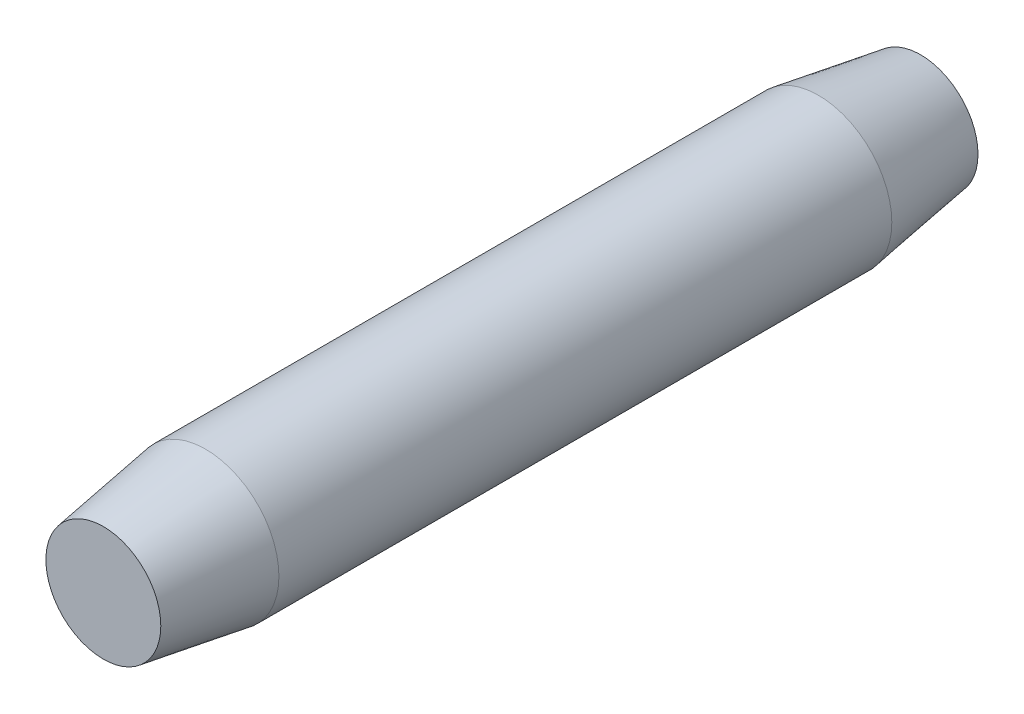
ISO-10303-21;
HEADER;
FILE_DESCRIPTION(('STEP AP214'),'2;1');
FILE_NAME('part.step','',(''),(''),'','','');
FILE_SCHEMA(('AUTOMOTIVE_DESIGN { 1 0 10303 214 1 1 1 1 }'));
ENDSEC;
DATA;
#1=APPLICATION_CONTEXT('core data for automotive mechanical design processes');
#2=APPLICATION_PROTOCOL_DEFINITION('international standard','automotive_design',2000,#1);
#3=PRODUCT_CONTEXT('',#1,'mechanical');
#4=PRODUCT('Part','Part','',(#3));
#5=PRODUCT_RELATED_PRODUCT_CATEGORY('part','',(#4));
#6=PRODUCT_DEFINITION_FORMATION('','',#4);
#7=PRODUCT_DEFINITION_CONTEXT('part definition',#1,'design');
#8=PRODUCT_DEFINITION('design','',#6,#7);
#9=PRODUCT_DEFINITION_SHAPE('','',#8);
#10=(LENGTH_UNIT() NAMED_UNIT(*) SI_UNIT(.MILLI.,.METRE.));
#11=(NAMED_UNIT(*) PLANE_ANGLE_UNIT() SI_UNIT($,.RADIAN.));
#12=(NAMED_UNIT(*) SI_UNIT($,.STERADIAN.) SOLID_ANGLE_UNIT());
#13=UNCERTAINTY_MEASURE_WITH_UNIT(LENGTH_MEASURE(1.E-05),#10,'distance_accuracy_value','');
#14=(GEOMETRIC_REPRESENTATION_CONTEXT(3) GLOBAL_UNCERTAINTY_ASSIGNED_CONTEXT((#13)) GLOBAL_UNIT_ASSIGNED_CONTEXT((#10,
#11,#12)) REPRESENTATION_CONTEXT('',''));
#15=CARTESIAN_POINT('',(0.,0.,0.));
#16=DIRECTION('',(0.,0.,1.));
#17=DIRECTION('',(1.,0.,0.));
#18=AXIS2_PLACEMENT_3D('',#15,#16,#17);
#19=CARTESIAN_POINT('',(0.,0.,101.6));
#20=DIRECTION('',(0.,0.,-1.));
#21=DIRECTION('',(-1.,0.,0.));
#22=AXIS2_PLACEMENT_3D('',#19,#20,#21);
#23=CYLINDRICAL_SURFACE('',#22,18.25625);
#24=CARTESIAN_POINT('',(0.,0.,-76.1999999999989));
#25=DIRECTION('',(0.,0.,1.));
#26=DIRECTION('',(1.,0.,0.));
#27=AXIS2_PLACEMENT_3D('',#24,#25,#26);
#28=CIRCLE('',#27,18.25625);
#29=CARTESIAN_POINT('',(18.25625,0.,-76.1999999999989));
#30=VERTEX_POINT('',#29);
#31=EDGE_CURVE('E39',#30,#30,#28,.T.);
#32=ORIENTED_EDGE('',*,*,#31,.T.);
#33=EDGE_LOOP('',(#32));
#34=FACE_BOUND('',#33,.T.);
#35=CARTESIAN_POINT('',(0.,0.,76.1999999999998));
#36=DIRECTION('',(0.,0.,1.));
#37=DIRECTION('',(1.,0.,0.));
#38=AXIS2_PLACEMENT_3D('',#35,#36,#37);
#39=CIRCLE('',#38,18.25625);
#40=CARTESIAN_POINT('',(18.25625,0.,76.1999999999998));
#41=VERTEX_POINT('',#40);
#42=EDGE_CURVE('E43',#41,#41,#39,.F.);
#43=ORIENTED_EDGE('',*,*,#42,.T.);
#44=EDGE_LOOP('',(#43));
#45=FACE_BOUND('',#44,.T.);
#46=ADVANCED_FACE('F32',(#34,#45),#23,.T.);
#47=CARTESIAN_POINT('',(0.,0.,101.6));
#48=DIRECTION('',(0.,0.,1.));
#49=DIRECTION('',(1.,0.,0.));
#50=AXIS2_PLACEMENT_3D('',#47,#48,#49);
#51=PLANE('',#50);
#52=CARTESIAN_POINT('',(0.,0.,101.6));
#53=DIRECTION('',(0.,0.,1.));
#54=DIRECTION('',(1.,0.,0.));
#55=AXIS2_PLACEMENT_3D('',#52,#53,#54);
#56=CIRCLE('',#55,14.2875000000001);
#57=CARTESIAN_POINT('',(14.2875000000001,0.,101.6));
#58=VERTEX_POINT('',#57);
#59=EDGE_CURVE('E47',#58,#58,#56,.T.);
#60=ORIENTED_EDGE('',*,*,#59,.T.);
#61=EDGE_LOOP('',(#60));
#62=FACE_BOUND('',#61,.T.);
#63=ADVANCED_FACE('F53',(#62),#51,.T.);
#64=CARTESIAN_POINT('',(0.,0.,-101.6));
#65=DIRECTION('',(0.,0.,1.));
#66=DIRECTION('',(1.,0.,0.));
#67=AXIS2_PLACEMENT_3D('',#64,#65,#66);
#68=PLANE('',#67);
#69=CARTESIAN_POINT('',(0.,0.,-101.6));
#70=DIRECTION('',(0.,0.,1.));
#71=DIRECTION('',(1.,0.,0.));
#72=AXIS2_PLACEMENT_3D('',#69,#70,#71);
#73=CIRCLE('',#72,14.2874999999999);
#74=CARTESIAN_POINT('',(14.2874999999999,0.,-101.6));
#75=VERTEX_POINT('',#74);
#76=EDGE_CURVE('E10',#75,#75,#73,.F.);
#77=ORIENTED_EDGE('',*,*,#76,.T.);
#78=EDGE_LOOP('',(#77));
#79=FACE_BOUND('',#78,.T.);
#80=ADVANCED_FACE('F57',(#79),#68,.F.);
#81=CARTESIAN_POINT('',(0.,0.,101.6));
#82=DIRECTION('',(0.,0.,-1.));
#83=DIRECTION('',(-1.,0.,0.));
#84=AXIS2_PLACEMENT_3D('',#81,#82,#83);
#85=CONICAL_SURFACE('',#84,14.2875000000001,0.154996741923938);
#86=ORIENTED_EDGE('',*,*,#42,.F.);
#87=EDGE_LOOP('',(#86));
#88=FACE_BOUND('',#87,.T.);
#89=ORIENTED_EDGE('',*,*,#59,.F.);
#90=EDGE_LOOP('',(#89));
#91=FACE_BOUND('',#90,.T.);
#92=ADVANCED_FACE('F55',(#88,#91),#85,.T.);
#93=CARTESIAN_POINT('',(0.,0.,-76.1999999999989));
#94=DIRECTION('',(0.,0.,1.));
#95=DIRECTION('',(1.,0.,0.));
#96=AXIS2_PLACEMENT_3D('',#93,#94,#95);
#97=CONICAL_SURFACE('',#96,18.25625,0.154996741923938);
#98=CARTESIAN_POINT('',(14.2874999999999,0.,-101.6));
#99=CARTESIAN_POINT('',(14.3288411458332,0.,-101.335416666667));
#100=CARTESIAN_POINT('',(14.3701822916666,0.,-101.070833333333));
#101=CARTESIAN_POINT('',(14.4528645833332,0.,-100.541666666667));
#102=CARTESIAN_POINT('',(14.4942057291666,0.,-100.277083333333));
#103=CARTESIAN_POINT('',(14.5768880208333,0.,-99.7479166666666));
#104=CARTESIAN_POINT('',(14.6182291666666,0.,-99.4833333333332));
#105=CARTESIAN_POINT('',(14.7009114583333,0.,-98.9541666666665));
#106=CARTESIAN_POINT('',(14.7422526041666,0.,-98.6895833333332));
#107=CARTESIAN_POINT('',(14.8249348958333,0.,-98.1604166666665));
#108=CARTESIAN_POINT('',(14.8662760416666,0.,-97.8958333333332));
#109=CARTESIAN_POINT('',(14.9489583333333,0.,-97.3666666666665));
#110=CARTESIAN_POINT('',(14.9902994791666,0.,-97.1020833333331));
#111=CARTESIAN_POINT('',(15.0729817708333,0.,-96.5729166666664));
#112=CARTESIAN_POINT('',(15.1143229166666,0.,-96.3083333333331));
#113=CARTESIAN_POINT('',(15.1970052083333,0.,-95.7791666666664));
#114=CARTESIAN_POINT('',(15.2383463541666,0.,-95.514583333333));
#115=CARTESIAN_POINT('',(15.3210286458333,0.,-94.9854166666664));
#116=CARTESIAN_POINT('',(15.3623697916666,0.,-94.720833333333));
#117=CARTESIAN_POINT('',(15.4450520833333,0.,-94.1916666666663));
#118=CARTESIAN_POINT('',(15.4863932291666,0.,-93.927083333333));
#119=CARTESIAN_POINT('',(15.5690755208333,0.,-93.3979166666663));
#120=CARTESIAN_POINT('',(15.6104166666666,0.,-93.1333333333329));
#121=CARTESIAN_POINT('',(15.6930989583333,0.,-92.6041666666662));
#122=CARTESIAN_POINT('',(15.7344401041666,0.,-92.3395833333329));
#123=CARTESIAN_POINT('',(15.8171223958333,0.,-91.8104166666662));
#124=CARTESIAN_POINT('',(15.8584635416666,0.,-91.5458333333329));
#125=CARTESIAN_POINT('',(15.9411458333333,0.,-91.0166666666662));
#126=CARTESIAN_POINT('',(15.9824869791666,0.,-90.7520833333328));
#127=CARTESIAN_POINT('',(16.0651692708333,0.,-90.2229166666662));
#128=CARTESIAN_POINT('',(16.1065104166666,0.,-89.9583333333328));
#129=CARTESIAN_POINT('',(16.1891927083333,0.,-89.4291666666661));
#130=CARTESIAN_POINT('',(16.2305338541666,0.,-89.1645833333328));
#131=CARTESIAN_POINT('',(16.3132161458333,0.,-88.6354166666661));
#132=CARTESIAN_POINT('',(16.3545572916666,0.,-88.3708333333327));
#133=CARTESIAN_POINT('',(16.4372395833333,0.,-87.841666666666));
#134=CARTESIAN_POINT('',(16.4785807291666,0.,-87.5770833333327));
#135=CARTESIAN_POINT('',(16.5612630208333,0.,-87.047916666666));
#136=CARTESIAN_POINT('',(16.6026041666666,0.,-86.7833333333327));
#137=CARTESIAN_POINT('',(16.6852864583333,0.,-86.254166666666));
#138=CARTESIAN_POINT('',(16.7266276041666,0.,-85.9895833333326));
#139=CARTESIAN_POINT('',(16.8093098958333,0.,-85.4604166666659));
#140=CARTESIAN_POINT('',(16.8506510416666,0.,-85.1958333333326));
#141=CARTESIAN_POINT('',(16.9333333333333,0.,-84.6666666666659));
#142=CARTESIAN_POINT('',(16.9746744791666,0.,-84.4020833333326));
#143=CARTESIAN_POINT('',(17.0573567708333,0.,-83.8729166666659));
#144=CARTESIAN_POINT('',(17.0986979166666,0.,-83.6083333333325));
#145=CARTESIAN_POINT('',(17.1813802083333,0.,-83.0791666666658));
#146=CARTESIAN_POINT('',(17.2227213541666,0.,-82.8145833333325));
#147=CARTESIAN_POINT('',(17.3054036458333,0.,-82.2854166666658));
#148=CARTESIAN_POINT('',(17.3467447916666,0.,-82.0208333333324));
#149=CARTESIAN_POINT('',(17.4294270833333,0.,-81.4916666666658));
#150=CARTESIAN_POINT('',(17.4707682291666,0.,-81.2270833333324));
#151=CARTESIAN_POINT('',(17.5534505208333,0.,-80.6979166666657));
#152=CARTESIAN_POINT('',(17.5947916666667,0.,-80.4333333333324));
#153=CARTESIAN_POINT('',(17.6774739583333,0.,-79.9041666666657));
#154=CARTESIAN_POINT('',(17.7188151041667,0.,-79.6395833333324));
#155=CARTESIAN_POINT('',(17.8014973958333,0.,-79.1104166666657));
#156=CARTESIAN_POINT('',(17.8428385416667,0.,-78.8458333333323));
#157=CARTESIAN_POINT('',(17.9255208333333,0.,-78.3166666666656));
#158=CARTESIAN_POINT('',(17.9668619791667,0.,-78.0520833333323));
#159=CARTESIAN_POINT('',(18.0495442708333,0.,-77.5229166666656));
#160=CARTESIAN_POINT('',(18.0908854166667,0.,-77.2583333333322));
#161=CARTESIAN_POINT('',(18.1735677083333,0.,-76.7291666666655));
#162=CARTESIAN_POINT('',(18.2149088541667,0.,-76.4645833333322));
#163=CARTESIAN_POINT('',(18.25625,0.,-76.1999999999989));
#164=B_SPLINE_CURVE_WITH_KNOTS('',3,(#98,#99,#100,#101,#102,#103,#104,#105,#106,#107,#108,#109,
#110,#111,#112,#113,#114,#115,#116,#117,#118,#119,#120,#121,#122,#123,#124,#125,#126,#127,#128,
#129,#130,#131,#132,#133,#134,#135,#136,#137,#138,#139,#140,#141,#142,#143,#144,#145,#146,#147,
#148,#149,#150,#151,#152,#153,#154,#155,#156,#157,#158,#159,#160,#161,#162,#163),.UNSPECIFIED.,
.F.,.F.,(4,2,2,2,2,2,2,2,2,2,2,2,2,2,2,2,2,2,2,2,2,2,2,2,2,2,2,2,2,2,2,2,4),(0.,
0.803380903152019,1.60676180630405,2.41014270945609,3.21352361260812,4.01690451576015,
4.82028541891219,5.62366632206422,6.42704722521625,7.23042812836827,8.03380903152031,
8.83718993467234,9.64057083782437,10.4439517409764,11.2473326441284,12.0507135472805,
12.8540944504325,13.6574753535845,14.4608562567366,15.2642371598886,16.0676180630406,
16.8709989661926,17.6743798693447,18.4777607724967,19.2811416756487,20.0845225788008,
20.8879034819528,21.6912843851048,22.4946652882569,23.2980461914089,24.1014270945609,
24.904807997713,25.708188900865),.UNSPECIFIED.);
#165=EDGE_CURVE('BSEAM34',#75,#30,#164,.T.);
#166=ORIENTED_EDGE('',*,*,#76,.F.);
#167=ORIENTED_EDGE('',*,*,#31,.F.);
#168=ORIENTED_EDGE('',*,*,#165,.T.);
#169=ORIENTED_EDGE('',*,*,#165,.F.);
#170=EDGE_LOOP('',(#166,#168,#167,#169));
#171=FACE_BOUND('',#170,.T.);
#172=ADVANCED_FACE('F34',(#171),#97,.T.);
#173=CLOSED_SHELL('',(#46,#63,#80,#92,#172));
#174=MANIFOLD_SOLID_BREP('B2',#173);
#175=ADVANCED_BREP_SHAPE_REPRESENTATION('',(#18,#174),#14);
#176=SHAPE_DEFINITION_REPRESENTATION(#9,#175);
ENDSEC;
END-ISO-10303-21;
